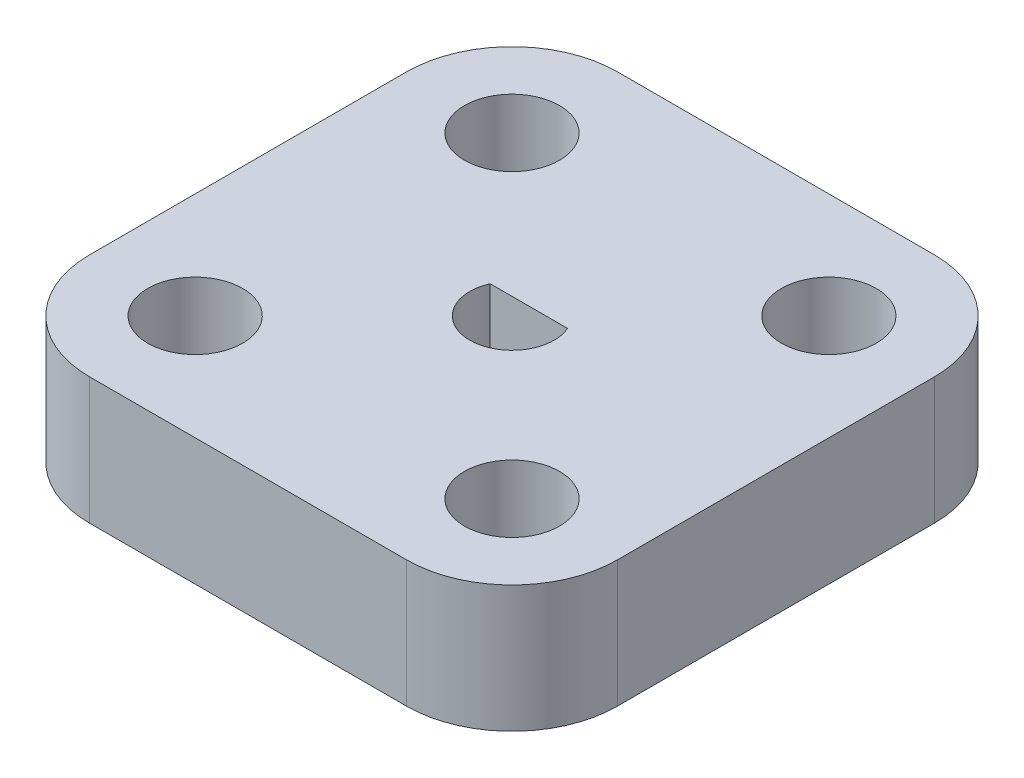
ISO-10303-21;
HEADER;
FILE_DESCRIPTION(('STEP AP214'),'2;1');
FILE_NAME('part.step','',(''),(''),'','','');
FILE_SCHEMA(('AUTOMOTIVE_DESIGN { 1 0 10303 214 1 1 1 1 }'));
ENDSEC;
DATA;
#1=APPLICATION_CONTEXT('core data for automotive mechanical design processes');
#2=APPLICATION_PROTOCOL_DEFINITION('international standard','automotive_design',2000,#1);
#3=PRODUCT_CONTEXT('',#1,'mechanical');
#4=PRODUCT('Part','Part','',(#3));
#5=PRODUCT_RELATED_PRODUCT_CATEGORY('part','',(#4));
#6=PRODUCT_DEFINITION_FORMATION('','',#4);
#7=PRODUCT_DEFINITION_CONTEXT('part definition',#1,'design');
#8=PRODUCT_DEFINITION('design','',#6,#7);
#9=PRODUCT_DEFINITION_SHAPE('','',#8);
#10=(LENGTH_UNIT() NAMED_UNIT(*) SI_UNIT(.MILLI.,.METRE.));
#11=(NAMED_UNIT(*) PLANE_ANGLE_UNIT() SI_UNIT($,.RADIAN.));
#12=(NAMED_UNIT(*) SI_UNIT($,.STERADIAN.) SOLID_ANGLE_UNIT());
#13=UNCERTAINTY_MEASURE_WITH_UNIT(LENGTH_MEASURE(1.E-05),#10,'distance_accuracy_value','');
#14=(GEOMETRIC_REPRESENTATION_CONTEXT(3) GLOBAL_UNCERTAINTY_ASSIGNED_CONTEXT((#13)) GLOBAL_UNIT_ASSIGNED_CONTEXT((#10,
#11,#12)) REPRESENTATION_CONTEXT('',''));
#15=CARTESIAN_POINT('',(0.,0.,0.));
#16=DIRECTION('',(0.,0.,1.));
#17=DIRECTION('',(1.,0.,0.));
#18=AXIS2_PLACEMENT_3D('',#15,#16,#17);
#19=CARTESIAN_POINT('',(0.,6.,-12.5));
#20=DIRECTION('',(0.,0.,-1.));
#21=DIRECTION('',(-1.,0.,0.));
#22=AXIS2_PLACEMENT_3D('',#19,#20,#21);
#23=PLANE('',#22);
#24=DIRECTION('',(1.,0.,0.));
#25=VECTOR('',#24,1.);
#26=CARTESIAN_POINT('',(0.,0.,-12.5));
#27=LINE('',#26,#25);
#28=CARTESIAN_POINT('',(-7.49999999999996,0.,-12.5));
#29=VERTEX_POINT('',#28);
#30=CARTESIAN_POINT('',(7.49999999999997,0.,-12.5));
#31=VERTEX_POINT('',#30);
#32=EDGE_CURVE('E155',#29,#31,#27,.T.);
#33=ORIENTED_EDGE('',*,*,#32,.F.);
#34=DIRECTION('',(0.,-1.,0.));
#35=VECTOR('',#34,1.);
#36=CARTESIAN_POINT('',(-7.49999999999996,6.,-12.5));
#37=LINE('',#36,#35);
#38=CARTESIAN_POINT('',(-7.49999999999996,6.,-12.5));
#39=VERTEX_POINT('',#38);
#40=EDGE_CURVE('E11',#39,#29,#37,.T.);
#41=ORIENTED_EDGE('',*,*,#40,.F.);
#42=DIRECTION('',(1.,0.,0.));
#43=VECTOR('',#42,1.);
#44=CARTESIAN_POINT('',(0.,6.,-12.5));
#45=LINE('',#44,#43);
#46=CARTESIAN_POINT('',(7.49999999999997,6.,-12.5));
#47=VERTEX_POINT('',#46);
#48=EDGE_CURVE('E332',#39,#47,#45,.T.);
#49=ORIENTED_EDGE('',*,*,#48,.T.);
#50=DIRECTION('',(0.,-1.,0.));
#51=VECTOR('',#50,1.);
#52=CARTESIAN_POINT('',(7.49999999999997,6.,-12.5));
#53=LINE('',#52,#51);
#54=EDGE_CURVE('E54',#47,#31,#53,.T.);
#55=ORIENTED_EDGE('',*,*,#54,.T.);
#56=EDGE_LOOP('',(#33,#41,#49,#55));
#57=FACE_BOUND('',#56,.T.);
#58=ADVANCED_FACE('F35',(#57),#23,.T.);
#59=CARTESIAN_POINT('',(-7.5,6.,-7.50000000000001));
#60=DIRECTION('',(0.,-1.,0.));
#61=DIRECTION('',(0.,0.,-1.));
#62=AXIS2_PLACEMENT_3D('',#59,#60,#61);
#63=CYLINDRICAL_SURFACE('',#62,5.);
#64=CARTESIAN_POINT('',(-7.5,0.,-7.50000000000001));
#65=DIRECTION('',(0.,1.,0.));
#66=DIRECTION('',(0.,0.,1.));
#67=AXIS2_PLACEMENT_3D('',#64,#65,#66);
#68=CIRCLE('',#67,5.);
#69=CARTESIAN_POINT('',(-12.5,0.,-7.49999999999997));
#70=VERTEX_POINT('',#69);
#71=EDGE_CURVE('E157',#29,#70,#68,.T.);
#72=ORIENTED_EDGE('',*,*,#71,.T.);
#73=DIRECTION('',(0.,-1.,0.));
#74=VECTOR('',#73,1.);
#75=CARTESIAN_POINT('',(-12.5,6.,-7.49999999999997));
#76=LINE('',#75,#74);
#77=CARTESIAN_POINT('',(-12.5,6.,-7.49999999999997));
#78=VERTEX_POINT('',#77);
#79=EDGE_CURVE('E45',#78,#70,#76,.T.);
#80=ORIENTED_EDGE('',*,*,#79,.F.);
#81=CARTESIAN_POINT('',(-7.5,6.,-7.50000000000001));
#82=DIRECTION('',(0.,1.,0.));
#83=DIRECTION('',(0.,0.,1.));
#84=AXIS2_PLACEMENT_3D('',#81,#82,#83);
#85=CIRCLE('',#84,5.);
#86=EDGE_CURVE('E334',#39,#78,#85,.T.);
#87=ORIENTED_EDGE('',*,*,#86,.F.);
#88=ORIENTED_EDGE('',*,*,#40,.T.);
#89=EDGE_LOOP('',(#72,#80,#87,#88));
#90=FACE_BOUND('',#89,.T.);
#91=ADVANCED_FACE('F211',(#90),#63,.T.);
#92=CARTESIAN_POINT('',(-12.5,6.,0.));
#93=DIRECTION('',(1.,0.,0.));
#94=DIRECTION('',(0.,0.,-1.));
#95=AXIS2_PLACEMENT_3D('',#92,#93,#94);
#96=PLANE('',#95);
#97=DIRECTION('',(0.,0.,1.));
#98=VECTOR('',#97,1.);
#99=CARTESIAN_POINT('',(-12.5,0.,0.));
#100=LINE('',#99,#98);
#101=CARTESIAN_POINT('',(-12.5,0.,7.49999999999996));
#102=VERTEX_POINT('',#101);
#103=EDGE_CURVE('E160',#70,#102,#100,.T.);
#104=ORIENTED_EDGE('',*,*,#103,.T.);
#105=DIRECTION('',(0.,-1.,0.));
#106=VECTOR('',#105,1.);
#107=CARTESIAN_POINT('',(-12.5,6.,7.49999999999996));
#108=LINE('',#107,#106);
#109=CARTESIAN_POINT('',(-12.5,6.,7.49999999999996));
#110=VERTEX_POINT('',#109);
#111=EDGE_CURVE('E181',#110,#102,#108,.T.);
#112=ORIENTED_EDGE('',*,*,#111,.F.);
#113=DIRECTION('',(0.,0.,1.));
#114=VECTOR('',#113,1.);
#115=CARTESIAN_POINT('',(-12.5,6.,0.));
#116=LINE('',#115,#114);
#117=EDGE_CURVE('E337',#78,#110,#116,.T.);
#118=ORIENTED_EDGE('',*,*,#117,.F.);
#119=ORIENTED_EDGE('',*,*,#79,.T.);
#120=EDGE_LOOP('',(#104,#112,#118,#119));
#121=FACE_BOUND('',#120,.T.);
#122=ADVANCED_FACE('F216',(#121),#96,.F.);
#123=CARTESIAN_POINT('',(-7.5,6.,7.5));
#124=DIRECTION('',(0.,-1.,0.));
#125=DIRECTION('',(0.,0.,-1.));
#126=AXIS2_PLACEMENT_3D('',#123,#124,#125);
#127=CYLINDRICAL_SURFACE('',#126,5.);
#128=CARTESIAN_POINT('',(-7.5,0.,7.5));
#129=DIRECTION('',(0.,1.,0.));
#130=DIRECTION('',(0.,0.,1.));
#131=AXIS2_PLACEMENT_3D('',#128,#129,#130);
#132=CIRCLE('',#131,5.);
#133=CARTESIAN_POINT('',(-7.49999999999996,0.,12.5));
#134=VERTEX_POINT('',#133);
#135=EDGE_CURVE('E163',#102,#134,#132,.T.);
#136=ORIENTED_EDGE('',*,*,#135,.T.);
#137=DIRECTION('',(0.,-1.,0.));
#138=VECTOR('',#137,1.);
#139=CARTESIAN_POINT('',(-7.49999999999996,6.,12.5));
#140=LINE('',#139,#138);
#141=CARTESIAN_POINT('',(-7.49999999999996,6.,12.5));
#142=VERTEX_POINT('',#141);
#143=EDGE_CURVE('E178',#142,#134,#140,.T.);
#144=ORIENTED_EDGE('',*,*,#143,.F.);
#145=CARTESIAN_POINT('',(-7.5,6.,7.5));
#146=DIRECTION('',(0.,1.,0.));
#147=DIRECTION('',(0.,0.,1.));
#148=AXIS2_PLACEMENT_3D('',#145,#146,#147);
#149=CIRCLE('',#148,5.);
#150=EDGE_CURVE('E340',#110,#142,#149,.T.);
#151=ORIENTED_EDGE('',*,*,#150,.F.);
#152=ORIENTED_EDGE('',*,*,#111,.T.);
#153=EDGE_LOOP('',(#136,#144,#151,#152));
#154=FACE_BOUND('',#153,.T.);
#155=ADVANCED_FACE('F222',(#154),#127,.T.);
#156=CARTESIAN_POINT('',(0.,6.,12.5));
#157=DIRECTION('',(0.,0.,-1.));
#158=DIRECTION('',(-1.,0.,0.));
#159=AXIS2_PLACEMENT_3D('',#156,#157,#158);
#160=PLANE('',#159);
#161=DIRECTION('',(1.,0.,0.));
#162=VECTOR('',#161,1.);
#163=CARTESIAN_POINT('',(0.,0.,12.5));
#164=LINE('',#163,#162);
#165=CARTESIAN_POINT('',(7.49999999999997,0.,12.5));
#166=VERTEX_POINT('',#165);
#167=EDGE_CURVE('E166',#134,#166,#164,.T.);
#168=ORIENTED_EDGE('',*,*,#167,.T.);
#169=DIRECTION('',(0.,-1.,0.));
#170=VECTOR('',#169,1.);
#171=CARTESIAN_POINT('',(7.49999999999997,6.,12.5));
#172=LINE('',#171,#170);
#173=CARTESIAN_POINT('',(7.49999999999997,6.,12.5));
#174=VERTEX_POINT('',#173);
#175=EDGE_CURVE('E139',#174,#166,#172,.T.);
#176=ORIENTED_EDGE('',*,*,#175,.F.);
#177=DIRECTION('',(1.,0.,0.));
#178=VECTOR('',#177,1.);
#179=CARTESIAN_POINT('',(0.,6.,12.5));
#180=LINE('',#179,#178);
#181=EDGE_CURVE('E128',#142,#174,#180,.T.);
#182=ORIENTED_EDGE('',*,*,#181,.F.);
#183=ORIENTED_EDGE('',*,*,#143,.T.);
#184=EDGE_LOOP('',(#168,#176,#182,#183));
#185=FACE_BOUND('',#184,.T.);
#186=ADVANCED_FACE('F226',(#185),#160,.F.);
#187=CARTESIAN_POINT('',(7.50000000000001,6.,7.5));
#188=DIRECTION('',(0.,-1.,0.));
#189=DIRECTION('',(0.,0.,-1.));
#190=AXIS2_PLACEMENT_3D('',#187,#188,#189);
#191=CYLINDRICAL_SURFACE('',#190,5.);
#192=CARTESIAN_POINT('',(7.50000000000001,0.,7.5));
#193=DIRECTION('',(0.,1.,0.));
#194=DIRECTION('',(0.,0.,1.));
#195=AXIS2_PLACEMENT_3D('',#192,#193,#194);
#196=CIRCLE('',#195,5.);
#197=CARTESIAN_POINT('',(12.5,0.,7.49999999999996));
#198=VERTEX_POINT('',#197);
#199=EDGE_CURVE('E136',#166,#198,#196,.T.);
#200=ORIENTED_EDGE('',*,*,#199,.T.);
#201=DIRECTION('',(0.,-1.,0.));
#202=VECTOR('',#201,1.);
#203=CARTESIAN_POINT('',(12.5,6.,7.49999999999996));
#204=LINE('',#203,#202);
#205=CARTESIAN_POINT('',(12.5,6.,7.49999999999996));
#206=VERTEX_POINT('',#205);
#207=EDGE_CURVE('E134',#206,#198,#204,.T.);
#208=ORIENTED_EDGE('',*,*,#207,.F.);
#209=CARTESIAN_POINT('',(7.50000000000001,6.,7.5));
#210=DIRECTION('',(0.,1.,0.));
#211=DIRECTION('',(0.,0.,1.));
#212=AXIS2_PLACEMENT_3D('',#209,#210,#211);
#213=CIRCLE('',#212,5.);
#214=EDGE_CURVE('E120',#174,#206,#213,.T.);
#215=ORIENTED_EDGE('',*,*,#214,.F.);
#216=ORIENTED_EDGE('',*,*,#175,.T.);
#217=EDGE_LOOP('',(#200,#208,#215,#216));
#218=FACE_BOUND('',#217,.T.);
#219=ADVANCED_FACE('F135',(#218),#191,.T.);
#220=CARTESIAN_POINT('',(12.5,6.,0.));
#221=DIRECTION('',(1.,0.,0.));
#222=DIRECTION('',(0.,0.,-1.));
#223=AXIS2_PLACEMENT_3D('',#220,#221,#222);
#224=PLANE('',#223);
#225=DIRECTION('',(0.,0.,1.));
#226=VECTOR('',#225,1.);
#227=CARTESIAN_POINT('',(12.5,0.,0.));
#228=LINE('',#227,#226);
#229=CARTESIAN_POINT('',(12.5,0.,-7.49999999999997));
#230=VERTEX_POINT('',#229);
#231=EDGE_CURVE('E170',#230,#198,#228,.T.);
#232=ORIENTED_EDGE('',*,*,#231,.F.);
#233=DIRECTION('',(0.,-1.,0.));
#234=VECTOR('',#233,1.);
#235=CARTESIAN_POINT('',(12.5,6.,-7.49999999999997));
#236=LINE('',#235,#234);
#237=CARTESIAN_POINT('',(12.5,6.,-7.49999999999997));
#238=VERTEX_POINT('',#237);
#239=EDGE_CURVE('E85',#238,#230,#236,.T.);
#240=ORIENTED_EDGE('',*,*,#239,.F.);
#241=DIRECTION('',(0.,0.,1.));
#242=VECTOR('',#241,1.);
#243=CARTESIAN_POINT('',(12.5,6.,0.));
#244=LINE('',#243,#242);
#245=EDGE_CURVE('E126',#238,#206,#244,.T.);
#246=ORIENTED_EDGE('',*,*,#245,.T.);
#247=ORIENTED_EDGE('',*,*,#207,.T.);
#248=EDGE_LOOP('',(#232,#240,#246,#247));
#249=FACE_BOUND('',#248,.T.);
#250=ADVANCED_FACE('F141',(#249),#224,.T.);
#251=CARTESIAN_POINT('',(0.,6.,-0.800000000000003));
#252=DIRECTION('',(0.,0.,-1.));
#253=DIRECTION('',(-1.,0.,0.));
#254=AXIS2_PLACEMENT_3D('',#251,#252,#253);
#255=PLANE('',#254);
#256=DIRECTION('',(1.,0.,0.));
#257=VECTOR('',#256,1.);
#258=CARTESIAN_POINT('',(0.,0.,-0.800000000000003));
#259=LINE('',#258,#257);
#260=CARTESIAN_POINT('',(-1.83303027798233,0.,-0.800000000000003));
#261=VERTEX_POINT('',#260);
#262=CARTESIAN_POINT('',(1.83303027798234,0.,-0.800000000000003));
#263=VERTEX_POINT('',#262);
#264=EDGE_CURVE('E148',#261,#263,#259,.T.);
#265=ORIENTED_EDGE('',*,*,#264,.T.);
#266=DIRECTION('',(0.,-1.,0.));
#267=VECTOR('',#266,1.);
#268=CARTESIAN_POINT('',(1.83303027798234,6.,-0.800000000000003));
#269=LINE('',#268,#267);
#270=CARTESIAN_POINT('',(1.83303027798234,6.,-0.800000000000003));
#271=VERTEX_POINT('',#270);
#272=EDGE_CURVE('E39',#271,#263,#269,.T.);
#273=ORIENTED_EDGE('',*,*,#272,.F.);
#274=DIRECTION('',(1.,0.,0.));
#275=VECTOR('',#274,1.);
#276=CARTESIAN_POINT('',(0.,6.,-0.800000000000003));
#277=LINE('',#276,#275);
#278=CARTESIAN_POINT('',(-1.83303027798233,6.,-0.800000000000003));
#279=VERTEX_POINT('',#278);
#280=EDGE_CURVE('E97',#279,#271,#277,.T.);
#281=ORIENTED_EDGE('',*,*,#280,.F.);
#282=DIRECTION('',(0.,-1.,0.));
#283=VECTOR('',#282,1.);
#284=CARTESIAN_POINT('',(-1.83303027798233,6.,-0.800000000000003));
#285=LINE('',#284,#283);
#286=EDGE_CURVE('E144',#279,#261,#285,.T.);
#287=ORIENTED_EDGE('',*,*,#286,.T.);
#288=EDGE_LOOP('',(#265,#273,#281,#287));
#289=FACE_BOUND('',#288,.T.);
#290=ADVANCED_FACE('F37',(#289),#255,.F.);
#291=CARTESIAN_POINT('',(0.,6.,0.));
#292=DIRECTION('',(0.,-1.,0.));
#293=DIRECTION('',(0.,0.,-1.));
#294=AXIS2_PLACEMENT_3D('',#291,#292,#293);
#295=CYLINDRICAL_SURFACE('',#294,2.);
#296=CARTESIAN_POINT('',(0.,0.,0.));
#297=DIRECTION('',(0.,1.,0.));
#298=DIRECTION('',(0.,0.,1.));
#299=AXIS2_PLACEMENT_3D('',#296,#297,#298);
#300=CIRCLE('',#299,2.);
#301=EDGE_CURVE('E151',#261,#263,#300,.T.);
#302=ORIENTED_EDGE('',*,*,#301,.F.);
#303=ORIENTED_EDGE('',*,*,#286,.F.);
#304=CARTESIAN_POINT('',(0.,6.,0.));
#305=DIRECTION('',(0.,1.,0.));
#306=DIRECTION('',(0.,0.,1.));
#307=AXIS2_PLACEMENT_3D('',#304,#305,#306);
#308=CIRCLE('',#307,2.);
#309=EDGE_CURVE('E191',#279,#271,#308,.T.);
#310=ORIENTED_EDGE('',*,*,#309,.T.);
#311=ORIENTED_EDGE('',*,*,#272,.T.);
#312=EDGE_LOOP('',(#302,#303,#310,#311));
#313=FACE_BOUND('',#312,.T.);
#314=ADVANCED_FACE('F190',(#313),#295,.F.);
#315=CARTESIAN_POINT('',(7.5,6.,-7.5));
#316=DIRECTION('',(0.,-1.,0.));
#317=DIRECTION('',(0.,0.,-1.));
#318=AXIS2_PLACEMENT_3D('',#315,#316,#317);
#319=CYLINDRICAL_SURFACE('',#318,5.);
#320=CARTESIAN_POINT('',(7.5,0.,-7.5));
#321=DIRECTION('',(0.,1.,0.));
#322=DIRECTION('',(0.,0.,1.));
#323=AXIS2_PLACEMENT_3D('',#320,#321,#322);
#324=CIRCLE('',#323,5.);
#325=EDGE_CURVE('E172',#31,#230,#324,.F.);
#326=ORIENTED_EDGE('',*,*,#325,.F.);
#327=ORIENTED_EDGE('',*,*,#54,.F.);
#328=CARTESIAN_POINT('',(7.5,6.,-7.5));
#329=DIRECTION('',(0.,1.,0.));
#330=DIRECTION('',(0.,0.,1.));
#331=AXIS2_PLACEMENT_3D('',#328,#329,#330);
#332=CIRCLE('',#331,5.);
#333=EDGE_CURVE('E142',#47,#238,#332,.F.);
#334=ORIENTED_EDGE('',*,*,#333,.T.);
#335=ORIENTED_EDGE('',*,*,#239,.T.);
#336=EDGE_LOOP('',(#326,#327,#334,#335));
#337=FACE_BOUND('',#336,.T.);
#338=ADVANCED_FACE('F200',(#337),#319,.T.);
#339=CARTESIAN_POINT('',(0.,6.,0.));
#340=DIRECTION('',(0.,1.,0.));
#341=DIRECTION('',(0.,0.,1.));
#342=AXIS2_PLACEMENT_3D('',#339,#340,#341);
#343=PLANE('',#342);
#344=CARTESIAN_POINT('',(-7.5,6.,-7.5));
#345=DIRECTION('',(0.,1.,0.));
#346=DIRECTION('',(0.,0.,1.));
#347=AXIS2_PLACEMENT_3D('',#344,#345,#346);
#348=CIRCLE('',#347,2.2479);
#349=CARTESIAN_POINT('',(-7.5,6.,-5.2521));
#350=VERTEX_POINT('',#349);
#351=EDGE_CURVE('E309',#350,#350,#348,.T.);
#352=ORIENTED_EDGE('',*,*,#351,.F.);
#353=EDGE_LOOP('',(#352));
#354=FACE_BOUND('',#353,.T.);
#355=CARTESIAN_POINT('',(7.5,6.,-7.5));
#356=DIRECTION('',(0.,1.,0.));
#357=DIRECTION('',(0.,0.,1.));
#358=AXIS2_PLACEMENT_3D('',#355,#356,#357);
#359=CIRCLE('',#358,2.2479);
#360=CARTESIAN_POINT('',(7.5,6.,-5.2521));
#361=VERTEX_POINT('',#360);
#362=EDGE_CURVE('E311',#361,#361,#359,.T.);
#363=ORIENTED_EDGE('',*,*,#362,.F.);
#364=EDGE_LOOP('',(#363));
#365=FACE_BOUND('',#364,.T.);
#366=CARTESIAN_POINT('',(-7.5,6.,7.5));
#367=DIRECTION('',(0.,1.,0.));
#368=DIRECTION('',(0.,0.,1.));
#369=AXIS2_PLACEMENT_3D('',#366,#367,#368);
#370=CIRCLE('',#369,2.2479);
#371=CARTESIAN_POINT('',(-7.5,6.,9.7479));
#372=VERTEX_POINT('',#371);
#373=EDGE_CURVE('E319',#372,#372,#370,.T.);
#374=ORIENTED_EDGE('',*,*,#373,.F.);
#375=EDGE_LOOP('',(#374));
#376=FACE_BOUND('',#375,.T.);
#377=CARTESIAN_POINT('',(7.5,6.,7.5));
#378=DIRECTION('',(0.,1.,0.));
#379=DIRECTION('',(0.,0.,1.));
#380=AXIS2_PLACEMENT_3D('',#377,#378,#379);
#381=CIRCLE('',#380,2.2479);
#382=CARTESIAN_POINT('',(7.5,6.,9.7479));
#383=VERTEX_POINT('',#382);
#384=EDGE_CURVE('E325',#383,#383,#381,.T.);
#385=ORIENTED_EDGE('',*,*,#384,.F.);
#386=EDGE_LOOP('',(#385));
#387=FACE_BOUND('',#386,.T.);
#388=ORIENTED_EDGE('',*,*,#280,.T.);
#389=ORIENTED_EDGE('',*,*,#309,.F.);
#390=EDGE_LOOP('',(#388,#389));
#391=FACE_BOUND('',#390,.T.);
#392=ORIENTED_EDGE('',*,*,#48,.F.);
#393=ORIENTED_EDGE('',*,*,#86,.T.);
#394=ORIENTED_EDGE('',*,*,#117,.T.);
#395=ORIENTED_EDGE('',*,*,#150,.T.);
#396=ORIENTED_EDGE('',*,*,#181,.T.);
#397=ORIENTED_EDGE('',*,*,#214,.T.);
#398=ORIENTED_EDGE('',*,*,#245,.F.);
#399=ORIENTED_EDGE('',*,*,#333,.F.);
#400=EDGE_LOOP('',(#392,#393,#394,#395,#396,#397,#398,#399));
#401=FACE_BOUND('',#400,.T.);
#402=ADVANCED_FACE('F123',(#354,#365,#376,#387,#391,#401),#343,.T.);
#403=CARTESIAN_POINT('',(0.,0.,0.));
#404=DIRECTION('',(0.,1.,0.));
#405=DIRECTION('',(0.,0.,1.));
#406=AXIS2_PLACEMENT_3D('',#403,#404,#405);
#407=PLANE('',#406);
#408=CARTESIAN_POINT('',(-7.5,0.,-7.5));
#409=DIRECTION('',(0.,1.,0.));
#410=DIRECTION('',(0.,0.,1.));
#411=AXIS2_PLACEMENT_3D('',#408,#409,#410);
#412=CIRCLE('',#411,2.2479);
#413=CARTESIAN_POINT('',(-7.5,0.,-5.2521));
#414=VERTEX_POINT('',#413);
#415=EDGE_CURVE('E306',#414,#414,#412,.T.);
#416=ORIENTED_EDGE('',*,*,#415,.T.);
#417=EDGE_LOOP('',(#416));
#418=FACE_BOUND('',#417,.T.);
#419=CARTESIAN_POINT('',(7.5,0.,-7.5));
#420=DIRECTION('',(0.,1.,0.));
#421=DIRECTION('',(0.,0.,1.));
#422=AXIS2_PLACEMENT_3D('',#419,#420,#421);
#423=CIRCLE('',#422,2.2479);
#424=CARTESIAN_POINT('',(7.5,0.,-5.2521));
#425=VERTEX_POINT('',#424);
#426=EDGE_CURVE('E316',#425,#425,#423,.T.);
#427=ORIENTED_EDGE('',*,*,#426,.T.);
#428=EDGE_LOOP('',(#427));
#429=FACE_BOUND('',#428,.T.);
#430=CARTESIAN_POINT('',(-7.5,0.,7.5));
#431=DIRECTION('',(0.,1.,0.));
#432=DIRECTION('',(0.,0.,1.));
#433=AXIS2_PLACEMENT_3D('',#430,#431,#432);
#434=CIRCLE('',#433,2.2479);
#435=CARTESIAN_POINT('',(-7.5,0.,9.7479));
#436=VERTEX_POINT('',#435);
#437=EDGE_CURVE('E322',#436,#436,#434,.T.);
#438=ORIENTED_EDGE('',*,*,#437,.T.);
#439=EDGE_LOOP('',(#438));
#440=FACE_BOUND('',#439,.T.);
#441=CARTESIAN_POINT('',(7.5,0.,7.5));
#442=DIRECTION('',(0.,1.,0.));
#443=DIRECTION('',(0.,0.,1.));
#444=AXIS2_PLACEMENT_3D('',#441,#442,#443);
#445=CIRCLE('',#444,2.2479);
#446=CARTESIAN_POINT('',(7.5,0.,9.7479));
#447=VERTEX_POINT('',#446);
#448=EDGE_CURVE('E152',#447,#447,#445,.T.);
#449=ORIENTED_EDGE('',*,*,#448,.T.);
#450=EDGE_LOOP('',(#449));
#451=FACE_BOUND('',#450,.T.);
#452=ORIENTED_EDGE('',*,*,#264,.F.);
#453=ORIENTED_EDGE('',*,*,#301,.T.);
#454=EDGE_LOOP('',(#452,#453));
#455=FACE_BOUND('',#454,.T.);
#456=ORIENTED_EDGE('',*,*,#32,.T.);
#457=ORIENTED_EDGE('',*,*,#325,.T.);
#458=ORIENTED_EDGE('',*,*,#231,.T.);
#459=ORIENTED_EDGE('',*,*,#199,.F.);
#460=ORIENTED_EDGE('',*,*,#167,.F.);
#461=ORIENTED_EDGE('',*,*,#135,.F.);
#462=ORIENTED_EDGE('',*,*,#103,.F.);
#463=ORIENTED_EDGE('',*,*,#71,.F.);
#464=EDGE_LOOP('',(#456,#457,#458,#459,#460,#461,#462,#463));
#465=FACE_BOUND('',#464,.T.);
#466=ADVANCED_FACE('F193',(#418,#429,#440,#451,#455,#465),#407,.F.);
#467=CARTESIAN_POINT('',(7.5,6.,7.5));
#468=DIRECTION('',(0.,1.,0.));
#469=DIRECTION('',(0.,0.,1.));
#470=AXIS2_PLACEMENT_3D('',#467,#468,#469);
#471=CYLINDRICAL_SURFACE('',#470,2.2479);
#472=ORIENTED_EDGE('',*,*,#448,.F.);
#473=EDGE_LOOP('',(#472));
#474=FACE_BOUND('',#473,.T.);
#475=ORIENTED_EDGE('',*,*,#384,.T.);
#476=EDGE_LOOP('',(#475));
#477=FACE_BOUND('',#476,.T.);
#478=ADVANCED_FACE('F196',(#474,#477),#471,.F.);
#479=CARTESIAN_POINT('',(-7.5,6.,7.5));
#480=DIRECTION('',(0.,1.,0.));
#481=DIRECTION('',(0.,0.,1.));
#482=AXIS2_PLACEMENT_3D('',#479,#480,#481);
#483=CYLINDRICAL_SURFACE('',#482,2.2479);
#484=ORIENTED_EDGE('',*,*,#437,.F.);
#485=EDGE_LOOP('',(#484));
#486=FACE_BOUND('',#485,.T.);
#487=ORIENTED_EDGE('',*,*,#373,.T.);
#488=EDGE_LOOP('',(#487));
#489=FACE_BOUND('',#488,.T.);
#490=ADVANCED_FACE('F269',(#486,#489),#483,.F.);
#491=CARTESIAN_POINT('',(7.5,6.,-7.5));
#492=DIRECTION('',(0.,1.,0.));
#493=DIRECTION('',(0.,0.,1.));
#494=AXIS2_PLACEMENT_3D('',#491,#492,#493);
#495=CYLINDRICAL_SURFACE('',#494,2.2479);
#496=ORIENTED_EDGE('',*,*,#426,.F.);
#497=EDGE_LOOP('',(#496));
#498=FACE_BOUND('',#497,.T.);
#499=ORIENTED_EDGE('',*,*,#362,.T.);
#500=EDGE_LOOP('',(#499));
#501=FACE_BOUND('',#500,.T.);
#502=ADVANCED_FACE('F279',(#498,#501),#495,.F.);
#503=CARTESIAN_POINT('',(-7.5,6.,-7.5));
#504=DIRECTION('',(0.,1.,0.));
#505=DIRECTION('',(0.,0.,1.));
#506=AXIS2_PLACEMENT_3D('',#503,#504,#505);
#507=CYLINDRICAL_SURFACE('',#506,2.2479);
#508=ORIENTED_EDGE('',*,*,#415,.F.);
#509=EDGE_LOOP('',(#508));
#510=FACE_BOUND('',#509,.T.);
#511=ORIENTED_EDGE('',*,*,#351,.T.);
#512=EDGE_LOOP('',(#511));
#513=FACE_BOUND('',#512,.T.);
#514=ADVANCED_FACE('F289',(#510,#513),#507,.F.);
#515=CLOSED_SHELL('',(#58,#91,#122,#155,#186,#219,#250,#290,#314,#338,#402,#466,#478,#490,#502,#514));
#516=MANIFOLD_SOLID_BREP('B2',#515);
#517=ADVANCED_BREP_SHAPE_REPRESENTATION('',(#18,#516),#14);
#518=SHAPE_DEFINITION_REPRESENTATION(#9,#517);
ENDSEC;
END-ISO-10303-21;
